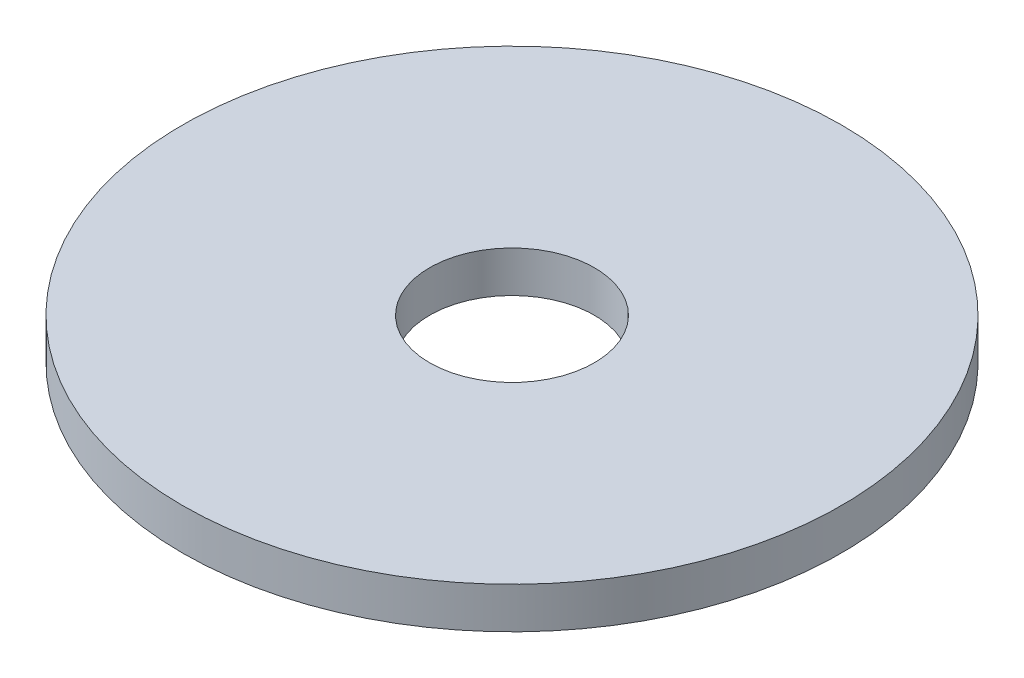
ISO-10303-21;
HEADER;
FILE_DESCRIPTION(('STEP AP214'),'2;1');
FILE_NAME('part.step','',(''),(''),'','','');
FILE_SCHEMA(('AUTOMOTIVE_DESIGN { 1 0 10303 214 1 1 1 1 }'));
ENDSEC;
DATA;
#1=APPLICATION_CONTEXT('core data for automotive mechanical design processes');
#2=APPLICATION_PROTOCOL_DEFINITION('international standard','automotive_design',2000,#1);
#3=PRODUCT_CONTEXT('',#1,'mechanical');
#4=PRODUCT('Part','Part','',(#3));
#5=PRODUCT_RELATED_PRODUCT_CATEGORY('part','',(#4));
#6=PRODUCT_DEFINITION_FORMATION('','',#4);
#7=PRODUCT_DEFINITION_CONTEXT('part definition',#1,'design');
#8=PRODUCT_DEFINITION('design','',#6,#7);
#9=PRODUCT_DEFINITION_SHAPE('','',#8);
#10=(LENGTH_UNIT() NAMED_UNIT(*) SI_UNIT(.MILLI.,.METRE.));
#11=(NAMED_UNIT(*) PLANE_ANGLE_UNIT() SI_UNIT($,.RADIAN.));
#12=(NAMED_UNIT(*) SI_UNIT($,.STERADIAN.) SOLID_ANGLE_UNIT());
#13=UNCERTAINTY_MEASURE_WITH_UNIT(LENGTH_MEASURE(1.E-05),#10,'distance_accuracy_value','');
#14=(GEOMETRIC_REPRESENTATION_CONTEXT(3) GLOBAL_UNCERTAINTY_ASSIGNED_CONTEXT((#13)) GLOBAL_UNIT_ASSIGNED_CONTEXT((#10,
#11,#12)) REPRESENTATION_CONTEXT('',''));
#15=CARTESIAN_POINT('',(0.,0.,0.));
#16=DIRECTION('',(0.,0.,1.));
#17=DIRECTION('',(1.,0.,0.));
#18=AXIS2_PLACEMENT_3D('',#15,#16,#17);
#19=CARTESIAN_POINT('',(0.,0.5,0.));
#20=DIRECTION('',(0.,1.,0.));
#21=DIRECTION('',(0.,0.,1.));
#22=AXIS2_PLACEMENT_3D('',#19,#20,#21);
#23=PLANE('',#22);
#24=CARTESIAN_POINT('',(0.,0.5,0.));
#25=DIRECTION('',(0.,1.,0.));
#26=DIRECTION('',(0.,0.,1.));
#27=AXIS2_PLACEMENT_3D('',#24,#25,#26);
#28=CIRCLE('',#27,4.);
#29=CARTESIAN_POINT('',(0.,0.5,4.));
#30=VERTEX_POINT('',#29);
#31=EDGE_CURVE('E10',#30,#30,#28,.T.);
#32=ORIENTED_EDGE('',*,*,#31,.T.);
#33=EDGE_LOOP('',(#32));
#34=FACE_BOUND('',#33,.T.);
#35=CARTESIAN_POINT('',(0.,0.5,0.));
#36=DIRECTION('',(0.,1.,0.));
#37=DIRECTION('',(0.,0.,1.));
#38=AXIS2_PLACEMENT_3D('',#35,#36,#37);
#39=CIRCLE('',#38,1.);
#40=CARTESIAN_POINT('',(0.,0.5,1.));
#41=VERTEX_POINT('',#40);
#42=EDGE_CURVE('E50',#41,#41,#39,.T.);
#43=ORIENTED_EDGE('',*,*,#42,.F.);
#44=EDGE_LOOP('',(#43));
#45=FACE_BOUND('',#44,.T.);
#46=ADVANCED_FACE('F39',(#34,#45),#23,.T.);
#47=CARTESIAN_POINT('',(0.,0.,0.));
#48=DIRECTION('',(0.,1.,0.));
#49=DIRECTION('',(0.,0.,1.));
#50=AXIS2_PLACEMENT_3D('',#47,#48,#49);
#51=PLANE('',#50);
#52=CARTESIAN_POINT('',(0.,0.,0.));
#53=DIRECTION('',(0.,1.,0.));
#54=DIRECTION('',(0.,0.,1.));
#55=AXIS2_PLACEMENT_3D('',#52,#53,#54);
#56=CIRCLE('',#55,4.);
#57=CARTESIAN_POINT('',(0.,0.,4.));
#58=VERTEX_POINT('',#57);
#59=EDGE_CURVE('E43',#58,#58,#56,.T.);
#60=ORIENTED_EDGE('',*,*,#59,.F.);
#61=EDGE_LOOP('',(#60));
#62=FACE_BOUND('',#61,.T.);
#63=CARTESIAN_POINT('',(0.,0.,0.));
#64=DIRECTION('',(0.,1.,0.));
#65=DIRECTION('',(0.,0.,1.));
#66=AXIS2_PLACEMENT_3D('',#63,#64,#65);
#67=CIRCLE('',#66,1.);
#68=CARTESIAN_POINT('',(0.,0.,1.));
#69=VERTEX_POINT('',#68);
#70=EDGE_CURVE('E52',#69,#69,#67,.T.);
#71=ORIENTED_EDGE('',*,*,#70,.T.);
#72=EDGE_LOOP('',(#71));
#73=FACE_BOUND('',#72,.T.);
#74=ADVANCED_FACE('F62',(#62,#73),#51,.F.);
#75=CARTESIAN_POINT('',(0.,0.5,0.));
#76=DIRECTION('',(0.,-1.,0.));
#77=DIRECTION('',(0.,0.,-1.));
#78=AXIS2_PLACEMENT_3D('',#75,#76,#77);
#79=CYLINDRICAL_SURFACE('',#78,4.);
#80=ORIENTED_EDGE('',*,*,#31,.F.);
#81=EDGE_LOOP('',(#80));
#82=FACE_BOUND('',#81,.T.);
#83=ORIENTED_EDGE('',*,*,#59,.T.);
#84=EDGE_LOOP('',(#83));
#85=FACE_BOUND('',#84,.T.);
#86=ADVANCED_FACE('F41',(#82,#85),#79,.T.);
#87=CARTESIAN_POINT('',(0.,0.5,0.));
#88=DIRECTION('',(0.,-1.,0.));
#89=DIRECTION('',(0.,0.,-1.));
#90=AXIS2_PLACEMENT_3D('',#87,#88,#89);
#91=CYLINDRICAL_SURFACE('',#90,1.);
#92=ORIENTED_EDGE('',*,*,#42,.T.);
#93=EDGE_LOOP('',(#92));
#94=FACE_BOUND('',#93,.T.);
#95=ORIENTED_EDGE('',*,*,#70,.F.);
#96=EDGE_LOOP('',(#95));
#97=FACE_BOUND('',#96,.T.);
#98=ADVANCED_FACE('F58',(#94,#97),#91,.F.);
#99=CLOSED_SHELL('',(#46,#74,#86,#98));
#100=MANIFOLD_SOLID_BREP('B2',#99);
#101=ADVANCED_BREP_SHAPE_REPRESENTATION('',(#18,#100),#14);
#102=SHAPE_DEFINITION_REPRESENTATION(#9,#101);
ENDSEC;
END-ISO-10303-21;
